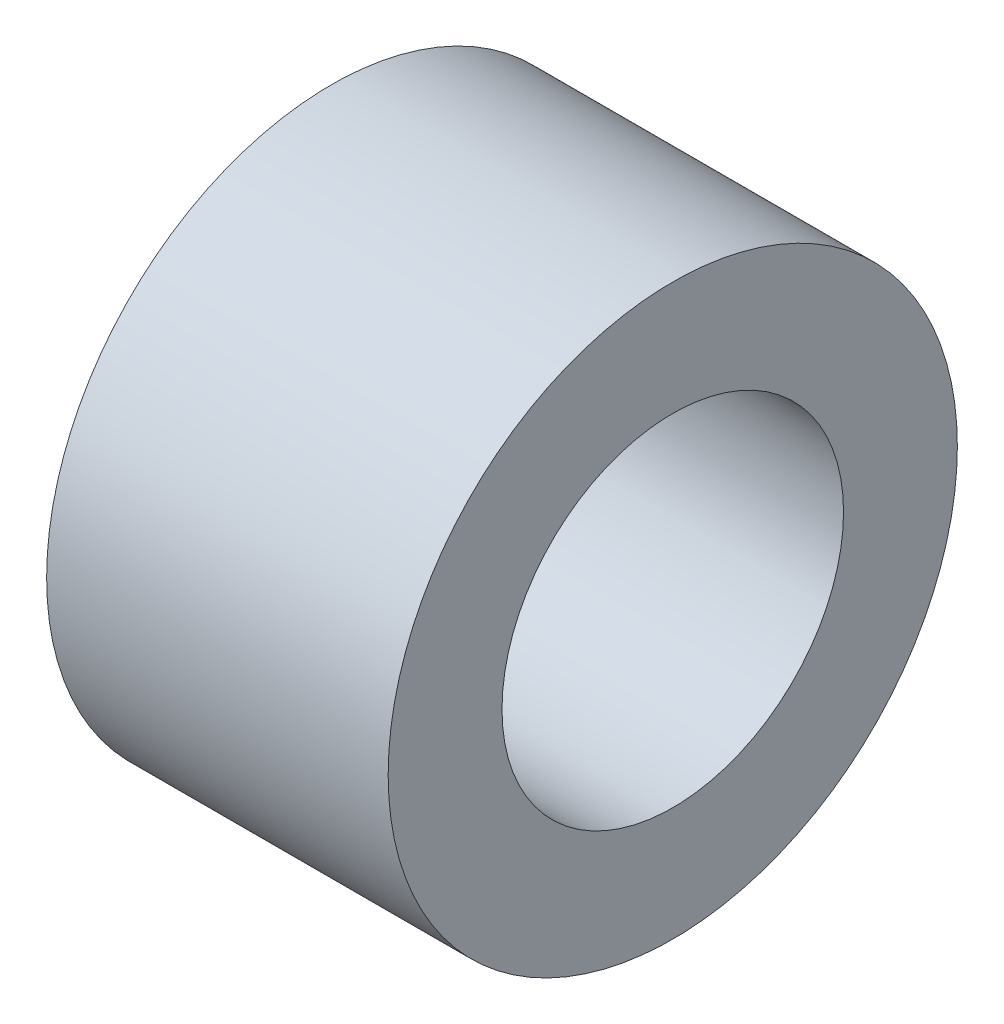
ISO-10303-21;
HEADER;
FILE_DESCRIPTION(('STEP AP214'),'2;1');
FILE_NAME('part.step','',(''),(''),'','','');
FILE_SCHEMA(('AUTOMOTIVE_DESIGN { 1 0 10303 214 1 1 1 1 }'));
ENDSEC;
DATA;
#1=APPLICATION_CONTEXT('core data for automotive mechanical design processes');
#2=APPLICATION_PROTOCOL_DEFINITION('international standard','automotive_design',2000,#1);
#3=PRODUCT_CONTEXT('',#1,'mechanical');
#4=PRODUCT('Part','Part','',(#3));
#5=PRODUCT_RELATED_PRODUCT_CATEGORY('part','',(#4));
#6=PRODUCT_DEFINITION_FORMATION('','',#4);
#7=PRODUCT_DEFINITION_CONTEXT('part definition',#1,'design');
#8=PRODUCT_DEFINITION('design','',#6,#7);
#9=PRODUCT_DEFINITION_SHAPE('','',#8);
#10=(LENGTH_UNIT() NAMED_UNIT(*) SI_UNIT(.MILLI.,.METRE.));
#11=(NAMED_UNIT(*) PLANE_ANGLE_UNIT() SI_UNIT($,.RADIAN.));
#12=(NAMED_UNIT(*) SI_UNIT($,.STERADIAN.) SOLID_ANGLE_UNIT());
#13=UNCERTAINTY_MEASURE_WITH_UNIT(LENGTH_MEASURE(1.E-05),#10,'distance_accuracy_value','');
#14=(GEOMETRIC_REPRESENTATION_CONTEXT(3) GLOBAL_UNCERTAINTY_ASSIGNED_CONTEXT((#13)) GLOBAL_UNIT_ASSIGNED_CONTEXT((#10,
#11,#12)) REPRESENTATION_CONTEXT('',''));
#15=CARTESIAN_POINT('',(0.,0.,0.));
#16=DIRECTION('',(0.,0.,1.));
#17=DIRECTION('',(1.,0.,0.));
#18=AXIS2_PLACEMENT_3D('',#15,#16,#17);
#19=CARTESIAN_POINT('',(0.,12.5,0.));
#20=DIRECTION('',(1.,0.,0.));
#21=DIRECTION('',(0.,0.,-1.));
#22=AXIS2_PLACEMENT_3D('',#19,#20,#21);
#23=PLANE('',#22);
#24=CARTESIAN_POINT('',(0.,0.,0.));
#25=DIRECTION('',(-1.,0.,0.));
#26=DIRECTION('',(0.,0.,1.));
#27=AXIS2_PLACEMENT_3D('',#24,#25,#26);
#28=CIRCLE('',#27,7.5);
#29=CARTESIAN_POINT('',(0.,0.,7.5));
#30=VERTEX_POINT('',#29);
#31=EDGE_CURVE('E10',#30,#30,#28,.T.);
#32=ORIENTED_EDGE('',*,*,#31,.F.);
#33=EDGE_LOOP('',(#32));
#34=FACE_BOUND('',#33,.T.);
#35=CARTESIAN_POINT('',(0.,0.,0.));
#36=DIRECTION('',(-1.,0.,0.));
#37=DIRECTION('',(0.,0.,1.));
#38=AXIS2_PLACEMENT_3D('',#35,#36,#37);
#39=CIRCLE('',#38,12.5);
#40=CARTESIAN_POINT('',(0.,0.,12.5));
#41=VERTEX_POINT('',#40);
#42=EDGE_CURVE('E45',#41,#41,#39,.T.);
#43=ORIENTED_EDGE('',*,*,#42,.T.);
#44=EDGE_LOOP('',(#43));
#45=FACE_BOUND('',#44,.T.);
#46=ADVANCED_FACE('F31',(#34,#45),#23,.F.);
#47=CARTESIAN_POINT('',(0.,0.,0.));
#48=DIRECTION('',(-1.,0.,0.));
#49=DIRECTION('',(0.,0.,1.));
#50=AXIS2_PLACEMENT_3D('',#47,#48,#49);
#51=CYLINDRICAL_SURFACE('',#50,7.5);
#52=CARTESIAN_POINT('',(15.,0.,0.));
#53=DIRECTION('',(-1.,0.,0.));
#54=DIRECTION('',(0.,0.,1.));
#55=AXIS2_PLACEMENT_3D('',#52,#53,#54);
#56=CIRCLE('',#55,7.5);
#57=CARTESIAN_POINT('',(15.,0.,7.5));
#58=VERTEX_POINT('',#57);
#59=EDGE_CURVE('E37',#58,#58,#56,.T.);
#60=ORIENTED_EDGE('',*,*,#59,.F.);
#61=EDGE_LOOP('',(#60));
#62=FACE_BOUND('',#61,.T.);
#63=ORIENTED_EDGE('',*,*,#31,.T.);
#64=EDGE_LOOP('',(#63));
#65=FACE_BOUND('',#64,.T.);
#66=ADVANCED_FACE('F60',(#62,#65),#51,.F.);
#67=CARTESIAN_POINT('',(15.,12.5,0.));
#68=DIRECTION('',(-1.,0.,0.));
#69=DIRECTION('',(0.,0.,1.));
#70=AXIS2_PLACEMENT_3D('',#67,#68,#69);
#71=PLANE('',#70);
#72=CARTESIAN_POINT('',(15.,0.,0.));
#73=DIRECTION('',(-1.,0.,0.));
#74=DIRECTION('',(0.,0.,1.));
#75=AXIS2_PLACEMENT_3D('',#72,#73,#74);
#76=CIRCLE('',#75,12.5);
#77=CARTESIAN_POINT('',(15.,0.,12.5));
#78=VERTEX_POINT('',#77);
#79=EDGE_CURVE('E41',#78,#78,#76,.T.);
#80=ORIENTED_EDGE('',*,*,#79,.F.);
#81=EDGE_LOOP('',(#80));
#82=FACE_BOUND('',#81,.T.);
#83=ORIENTED_EDGE('',*,*,#59,.T.);
#84=EDGE_LOOP('',(#83));
#85=FACE_BOUND('',#84,.T.);
#86=ADVANCED_FACE('F55',(#82,#85),#71,.F.);
#87=CARTESIAN_POINT('',(0.,0.,0.));
#88=DIRECTION('',(-1.,0.,0.));
#89=DIRECTION('',(0.,0.,1.));
#90=AXIS2_PLACEMENT_3D('',#87,#88,#89);
#91=CYLINDRICAL_SURFACE('',#90,12.5);
#92=ORIENTED_EDGE('',*,*,#42,.F.);
#93=EDGE_LOOP('',(#92));
#94=FACE_BOUND('',#93,.T.);
#95=ORIENTED_EDGE('',*,*,#79,.T.);
#96=EDGE_LOOP('',(#95));
#97=FACE_BOUND('',#96,.T.);
#98=ADVANCED_FACE('F52',(#94,#97),#91,.T.);
#99=CLOSED_SHELL('',(#46,#66,#86,#98));
#100=MANIFOLD_SOLID_BREP('B2',#99);
#101=ADVANCED_BREP_SHAPE_REPRESENTATION('',(#18,#100),#14);
#102=SHAPE_DEFINITION_REPRESENTATION(#9,#101);
ENDSEC;
END-ISO-10303-21;
